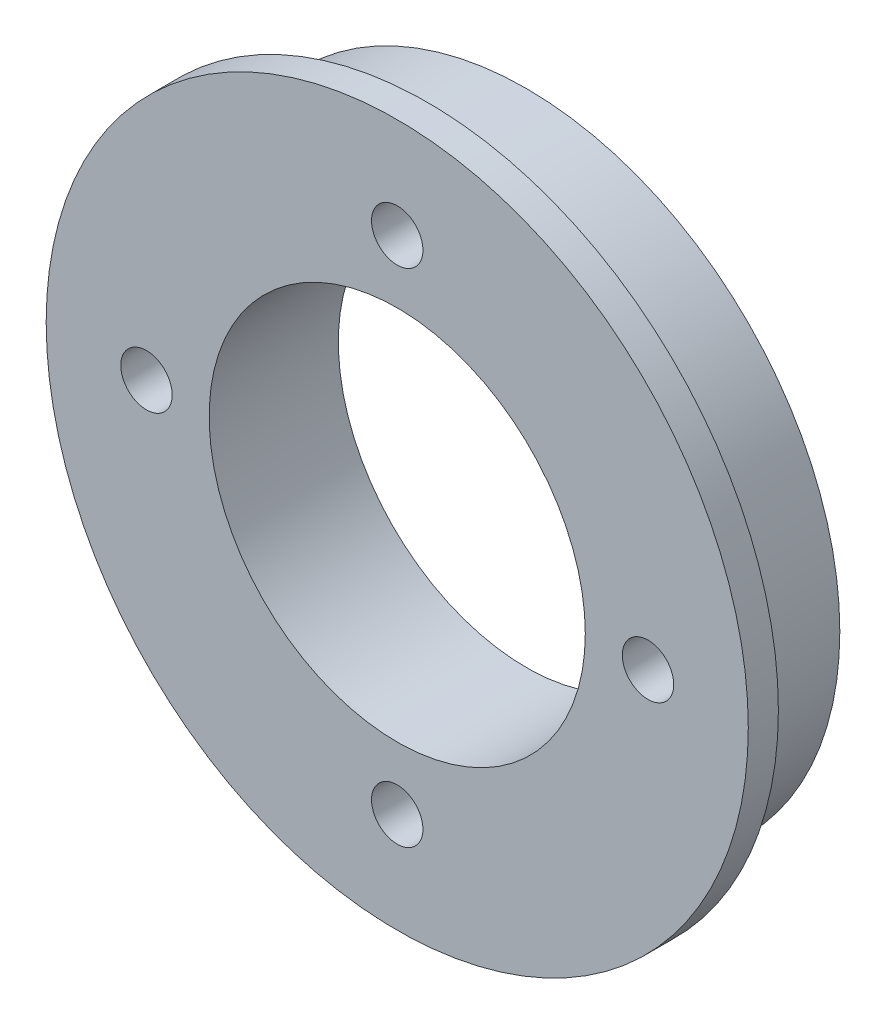
ISO-10303-21;
HEADER;
FILE_DESCRIPTION(('STEP AP214'),'2;1');
FILE_NAME('part.step','',(''),(''),'','','');
FILE_SCHEMA(('AUTOMOTIVE_DESIGN { 1 0 10303 214 1 1 1 1 }'));
ENDSEC;
DATA;
#1=APPLICATION_CONTEXT('core data for automotive mechanical design processes');
#2=APPLICATION_PROTOCOL_DEFINITION('international standard','automotive_design',2000,#1);
#3=PRODUCT_CONTEXT('',#1,'mechanical');
#4=PRODUCT('Part','Part','',(#3));
#5=PRODUCT_RELATED_PRODUCT_CATEGORY('part','',(#4));
#6=PRODUCT_DEFINITION_FORMATION('','',#4);
#7=PRODUCT_DEFINITION_CONTEXT('part definition',#1,'design');
#8=PRODUCT_DEFINITION('design','',#6,#7);
#9=PRODUCT_DEFINITION_SHAPE('','',#8);
#10=(LENGTH_UNIT() NAMED_UNIT(*) SI_UNIT(.MILLI.,.METRE.));
#11=(NAMED_UNIT(*) PLANE_ANGLE_UNIT() SI_UNIT($,.RADIAN.));
#12=(NAMED_UNIT(*) SI_UNIT($,.STERADIAN.) SOLID_ANGLE_UNIT());
#13=UNCERTAINTY_MEASURE_WITH_UNIT(LENGTH_MEASURE(1.E-05),#10,'distance_accuracy_value','');
#14=(GEOMETRIC_REPRESENTATION_CONTEXT(3) GLOBAL_UNCERTAINTY_ASSIGNED_CONTEXT((#13)) GLOBAL_UNIT_ASSIGNED_CONTEXT((#10,
#11,#12)) REPRESENTATION_CONTEXT('',''));
#15=CARTESIAN_POINT('',(0.,0.,0.));
#16=DIRECTION('',(0.,0.,1.));
#17=DIRECTION('',(1.,0.,0.));
#18=AXIS2_PLACEMENT_3D('',#15,#16,#17);
#19=CARTESIAN_POINT('',(0.,0.,0.));
#20=DIRECTION('',(0.,0.,1.));
#21=DIRECTION('',(1.,0.,0.));
#22=AXIS2_PLACEMENT_3D('',#19,#20,#21);
#23=PLANE('',#22);
#24=CARTESIAN_POINT('',(10.,1.04744440165294E-13,0.));
#25=DIRECTION('',(0.,0.,-1.));
#26=DIRECTION('',(-1.,0.,0.));
#27=AXIS2_PLACEMENT_3D('',#24,#25,#26);
#28=CIRCLE('',#27,1.02499999999999);
#29=CARTESIAN_POINT('',(8.97500000000001,1.04744440165294E-13,0.));
#30=VERTEX_POINT('',#29);
#31=EDGE_CURVE('E82',#30,#30,#28,.T.);
#32=ORIENTED_EDGE('',*,*,#31,.F.);
#33=EDGE_LOOP('',(#32));
#34=FACE_BOUND('',#33,.T.);
#35=CARTESIAN_POINT('',(0.,-10.,0.));
#36=DIRECTION('',(0.,0.,-1.));
#37=DIRECTION('',(-1.,0.,0.));
#38=AXIS2_PLACEMENT_3D('',#35,#36,#37);
#39=CIRCLE('',#38,1.02499999999999);
#40=CARTESIAN_POINT('',(-1.02499999999999,-10.,0.));
#41=VERTEX_POINT('',#40);
#42=EDGE_CURVE('E76',#41,#41,#39,.T.);
#43=ORIENTED_EDGE('',*,*,#42,.F.);
#44=EDGE_LOOP('',(#43));
#45=FACE_BOUND('',#44,.T.);
#46=CARTESIAN_POINT('',(-10.,0.,0.));
#47=DIRECTION('',(0.,0.,-1.));
#48=DIRECTION('',(-1.,0.,0.));
#49=AXIS2_PLACEMENT_3D('',#46,#47,#48);
#50=CIRCLE('',#49,1.02499999999999);
#51=CARTESIAN_POINT('',(-11.025,0.,0.));
#52=VERTEX_POINT('',#51);
#53=EDGE_CURVE('E70',#52,#52,#50,.T.);
#54=ORIENTED_EDGE('',*,*,#53,.F.);
#55=EDGE_LOOP('',(#54));
#56=FACE_BOUND('',#55,.T.);
#57=CARTESIAN_POINT('',(0.,10.,0.));
#58=DIRECTION('',(0.,0.,-1.));
#59=DIRECTION('',(-1.,0.,0.));
#60=AXIS2_PLACEMENT_3D('',#57,#58,#59);
#61=CIRCLE('',#60,1.02499999999999);
#62=CARTESIAN_POINT('',(-1.02499999999999,10.,0.));
#63=VERTEX_POINT('',#62);
#64=EDGE_CURVE('E64',#63,#63,#61,.T.);
#65=ORIENTED_EDGE('',*,*,#64,.F.);
#66=EDGE_LOOP('',(#65));
#67=FACE_BOUND('',#66,.T.);
#68=CARTESIAN_POINT('',(0.,0.,0.));
#69=DIRECTION('',(0.,0.,1.));
#70=DIRECTION('',(1.,0.,0.));
#71=AXIS2_PLACEMENT_3D('',#68,#69,#70);
#72=CIRCLE('',#71,12.5);
#73=CARTESIAN_POINT('',(12.5,0.,0.));
#74=VERTEX_POINT('',#73);
#75=EDGE_CURVE('E41',#74,#74,#72,.T.);
#76=ORIENTED_EDGE('',*,*,#75,.F.);
#77=EDGE_LOOP('',(#76));
#78=FACE_BOUND('',#77,.T.);
#79=CARTESIAN_POINT('',(0.,0.,0.));
#80=DIRECTION('',(0.,0.,1.));
#81=DIRECTION('',(1.,0.,0.));
#82=AXIS2_PLACEMENT_3D('',#79,#80,#81);
#83=CIRCLE('',#82,7.5);
#84=CARTESIAN_POINT('',(7.5,0.,0.));
#85=VERTEX_POINT('',#84);
#86=EDGE_CURVE('E48',#85,#85,#83,.T.);
#87=ORIENTED_EDGE('',*,*,#86,.T.);
#88=EDGE_LOOP('',(#87));
#89=FACE_BOUND('',#88,.T.);
#90=ADVANCED_FACE('F37',(#34,#45,#56,#67,#78,#89),#23,.F.);
#91=CARTESIAN_POINT('',(0.,0.,3.95));
#92=DIRECTION('',(0.,0.,-1.));
#93=DIRECTION('',(-1.,0.,0.));
#94=AXIS2_PLACEMENT_3D('',#91,#92,#93);
#95=CYLINDRICAL_SURFACE('',#94,12.5);
#96=CARTESIAN_POINT('',(0.,0.,3.95));
#97=DIRECTION('',(0.,0.,1.));
#98=DIRECTION('',(1.,0.,0.));
#99=AXIS2_PLACEMENT_3D('',#96,#97,#98);
#100=CIRCLE('',#99,12.5);
#101=CARTESIAN_POINT('',(12.5,0.,3.95));
#102=VERTEX_POINT('',#101);
#103=EDGE_CURVE('E10',#102,#102,#100,.T.);
#104=ORIENTED_EDGE('',*,*,#103,.F.);
#105=EDGE_LOOP('',(#104));
#106=FACE_BOUND('',#105,.T.);
#107=ORIENTED_EDGE('',*,*,#75,.T.);
#108=EDGE_LOOP('',(#107));
#109=FACE_BOUND('',#108,.T.);
#110=ADVANCED_FACE('F39',(#106,#109),#95,.T.);
#111=CARTESIAN_POINT('',(0.,0.,3.95));
#112=DIRECTION('',(0.,0.,-1.));
#113=DIRECTION('',(-1.,0.,0.));
#114=AXIS2_PLACEMENT_3D('',#111,#112,#113);
#115=CYLINDRICAL_SURFACE('',#114,7.5);
#116=ORIENTED_EDGE('',*,*,#86,.F.);
#117=EDGE_LOOP('',(#116));
#118=FACE_BOUND('',#117,.T.);
#119=CARTESIAN_POINT('',(0.,0.,5.15));
#120=DIRECTION('',(0.,0.,1.));
#121=DIRECTION('',(1.,0.,0.));
#122=AXIS2_PLACEMENT_3D('',#119,#120,#121);
#123=CIRCLE('',#122,7.5);
#124=CARTESIAN_POINT('',(7.5,0.,5.15));
#125=VERTEX_POINT('',#124);
#126=EDGE_CURVE('E56',#125,#125,#123,.T.);
#127=ORIENTED_EDGE('',*,*,#126,.T.);
#128=EDGE_LOOP('',(#127));
#129=FACE_BOUND('',#128,.T.);
#130=ADVANCED_FACE('F100',(#118,#129),#115,.F.);
#131=CARTESIAN_POINT('',(0.,0.,5.15));
#132=DIRECTION('',(0.,0.,1.));
#133=DIRECTION('',(1.,0.,0.));
#134=AXIS2_PLACEMENT_3D('',#131,#132,#133);
#135=PLANE('',#134);
#136=CARTESIAN_POINT('',(10.,1.04744440165294E-13,5.15));
#137=DIRECTION('',(0.,0.,-1.));
#138=DIRECTION('',(-1.,0.,0.));
#139=AXIS2_PLACEMENT_3D('',#136,#137,#138);
#140=CIRCLE('',#139,1.025);
#141=CARTESIAN_POINT('',(8.975,1.04744440165294E-13,5.15));
#142=VERTEX_POINT('',#141);
#143=EDGE_CURVE('E79',#142,#142,#140,.T.);
#144=ORIENTED_EDGE('',*,*,#143,.T.);
#145=EDGE_LOOP('',(#144));
#146=FACE_BOUND('',#145,.T.);
#147=CARTESIAN_POINT('',(0.,-10.,5.15));
#148=DIRECTION('',(0.,0.,-1.));
#149=DIRECTION('',(-1.,0.,0.));
#150=AXIS2_PLACEMENT_3D('',#147,#148,#149);
#151=CIRCLE('',#150,1.025);
#152=CARTESIAN_POINT('',(-1.025,-10.,5.15));
#153=VERTEX_POINT('',#152);
#154=EDGE_CURVE('E73',#153,#153,#151,.T.);
#155=ORIENTED_EDGE('',*,*,#154,.T.);
#156=EDGE_LOOP('',(#155));
#157=FACE_BOUND('',#156,.T.);
#158=CARTESIAN_POINT('',(-10.,0.,5.15));
#159=DIRECTION('',(0.,0.,-1.));
#160=DIRECTION('',(-1.,0.,0.));
#161=AXIS2_PLACEMENT_3D('',#158,#159,#160);
#162=CIRCLE('',#161,1.025);
#163=CARTESIAN_POINT('',(-11.025,0.,5.15));
#164=VERTEX_POINT('',#163);
#165=EDGE_CURVE('E67',#164,#164,#162,.T.);
#166=ORIENTED_EDGE('',*,*,#165,.T.);
#167=EDGE_LOOP('',(#166));
#168=FACE_BOUND('',#167,.T.);
#169=CARTESIAN_POINT('',(0.,10.,5.15));
#170=DIRECTION('',(0.,0.,-1.));
#171=DIRECTION('',(-1.,0.,0.));
#172=AXIS2_PLACEMENT_3D('',#169,#170,#171);
#173=CIRCLE('',#172,1.025);
#174=CARTESIAN_POINT('',(-1.025,10.,5.15));
#175=VERTEX_POINT('',#174);
#176=EDGE_CURVE('E61',#175,#175,#173,.T.);
#177=ORIENTED_EDGE('',*,*,#176,.T.);
#178=EDGE_LOOP('',(#177));
#179=FACE_BOUND('',#178,.T.);
#180=CARTESIAN_POINT('',(0.,0.,5.15));
#181=DIRECTION('',(0.,0.,1.));
#182=DIRECTION('',(1.,0.,0.));
#183=AXIS2_PLACEMENT_3D('',#180,#181,#182);
#184=CIRCLE('',#183,14.);
#185=CARTESIAN_POINT('',(14.,0.,5.15));
#186=VERTEX_POINT('',#185);
#187=EDGE_CURVE('E52',#186,#186,#184,.T.);
#188=ORIENTED_EDGE('',*,*,#187,.T.);
#189=EDGE_LOOP('',(#188));
#190=FACE_BOUND('',#189,.T.);
#191=ORIENTED_EDGE('',*,*,#126,.F.);
#192=EDGE_LOOP('',(#191));
#193=FACE_BOUND('',#192,.T.);
#194=ADVANCED_FACE('F103',(#146,#157,#168,#179,#190,#193),#135,.T.);
#195=CARTESIAN_POINT('',(0.,0.,3.95));
#196=DIRECTION('',(0.,0.,1.));
#197=DIRECTION('',(1.,0.,0.));
#198=AXIS2_PLACEMENT_3D('',#195,#196,#197);
#199=PLANE('',#198);
#200=ORIENTED_EDGE('',*,*,#103,.T.);
#201=EDGE_LOOP('',(#200));
#202=FACE_BOUND('',#201,.T.);
#203=CARTESIAN_POINT('',(0.,0.,3.95));
#204=DIRECTION('',(0.,0.,1.));
#205=DIRECTION('',(1.,0.,0.));
#206=AXIS2_PLACEMENT_3D('',#203,#204,#205);
#207=CIRCLE('',#206,14.);
#208=CARTESIAN_POINT('',(14.,0.,3.95));
#209=VERTEX_POINT('',#208);
#210=EDGE_CURVE('E53',#209,#209,#207,.T.);
#211=ORIENTED_EDGE('',*,*,#210,.F.);
#212=EDGE_LOOP('',(#211));
#213=FACE_BOUND('',#212,.T.);
#214=ADVANCED_FACE('F108',(#202,#213),#199,.F.);
#215=CARTESIAN_POINT('',(0.,0.,5.15));
#216=DIRECTION('',(0.,0.,-1.));
#217=DIRECTION('',(-1.,0.,0.));
#218=AXIS2_PLACEMENT_3D('',#215,#216,#217);
#219=CYLINDRICAL_SURFACE('',#218,14.);
#220=ORIENTED_EDGE('',*,*,#187,.F.);
#221=EDGE_LOOP('',(#220));
#222=FACE_BOUND('',#221,.T.);
#223=ORIENTED_EDGE('',*,*,#210,.T.);
#224=EDGE_LOOP('',(#223));
#225=FACE_BOUND('',#224,.T.);
#226=ADVANCED_FACE('F114',(#222,#225),#219,.T.);
#227=CARTESIAN_POINT('',(0.,10.,0.));
#228=DIRECTION('',(0.,0.,-1.));
#229=DIRECTION('',(-1.,0.,0.));
#230=AXIS2_PLACEMENT_3D('',#227,#228,#229);
#231=CYLINDRICAL_SURFACE('',#230,1.02499999999999);
#232=ORIENTED_EDGE('',*,*,#176,.F.);
#233=EDGE_LOOP('',(#232));
#234=FACE_BOUND('',#233,.T.);
#235=ORIENTED_EDGE('',*,*,#64,.T.);
#236=EDGE_LOOP('',(#235));
#237=FACE_BOUND('',#236,.T.);
#238=ADVANCED_FACE('F118',(#234,#237),#231,.F.);
#239=CARTESIAN_POINT('',(-10.,0.,0.));
#240=DIRECTION('',(0.,0.,-1.));
#241=DIRECTION('',(-1.,0.,0.));
#242=AXIS2_PLACEMENT_3D('',#239,#240,#241);
#243=CYLINDRICAL_SURFACE('',#242,1.02499999999999);
#244=ORIENTED_EDGE('',*,*,#165,.F.);
#245=EDGE_LOOP('',(#244));
#246=FACE_BOUND('',#245,.T.);
#247=ORIENTED_EDGE('',*,*,#53,.T.);
#248=EDGE_LOOP('',(#247));
#249=FACE_BOUND('',#248,.T.);
#250=ADVANCED_FACE('F126',(#246,#249),#243,.F.);
#251=CARTESIAN_POINT('',(0.,-10.,0.));
#252=DIRECTION('',(0.,0.,-1.));
#253=DIRECTION('',(-1.,0.,0.));
#254=AXIS2_PLACEMENT_3D('',#251,#252,#253);
#255=CYLINDRICAL_SURFACE('',#254,1.02499999999999);
#256=ORIENTED_EDGE('',*,*,#154,.F.);
#257=EDGE_LOOP('',(#256));
#258=FACE_BOUND('',#257,.T.);
#259=ORIENTED_EDGE('',*,*,#42,.T.);
#260=EDGE_LOOP('',(#259));
#261=FACE_BOUND('',#260,.T.);
#262=ADVANCED_FACE('F136',(#258,#261),#255,.F.);
#263=CARTESIAN_POINT('',(10.,1.04744440165294E-13,0.));
#264=DIRECTION('',(0.,0.,-1.));
#265=DIRECTION('',(-1.,0.,0.));
#266=AXIS2_PLACEMENT_3D('',#263,#264,#265);
#267=CYLINDRICAL_SURFACE('',#266,1.02499999999999);
#268=ORIENTED_EDGE('',*,*,#143,.F.);
#269=EDGE_LOOP('',(#268));
#270=FACE_BOUND('',#269,.T.);
#271=ORIENTED_EDGE('',*,*,#31,.T.);
#272=EDGE_LOOP('',(#271));
#273=FACE_BOUND('',#272,.T.);
#274=ADVANCED_FACE('F86',(#270,#273),#267,.F.);
#275=CLOSED_SHELL('',(#90,#110,#130,#194,#214,#226,#238,#250,#262,#274));
#276=MANIFOLD_SOLID_BREP('B2',#275);
#277=ADVANCED_BREP_SHAPE_REPRESENTATION('',(#18,#276),#14);
#278=SHAPE_DEFINITION_REPRESENTATION(#9,#277);
ENDSEC;
END-ISO-10303-21;
